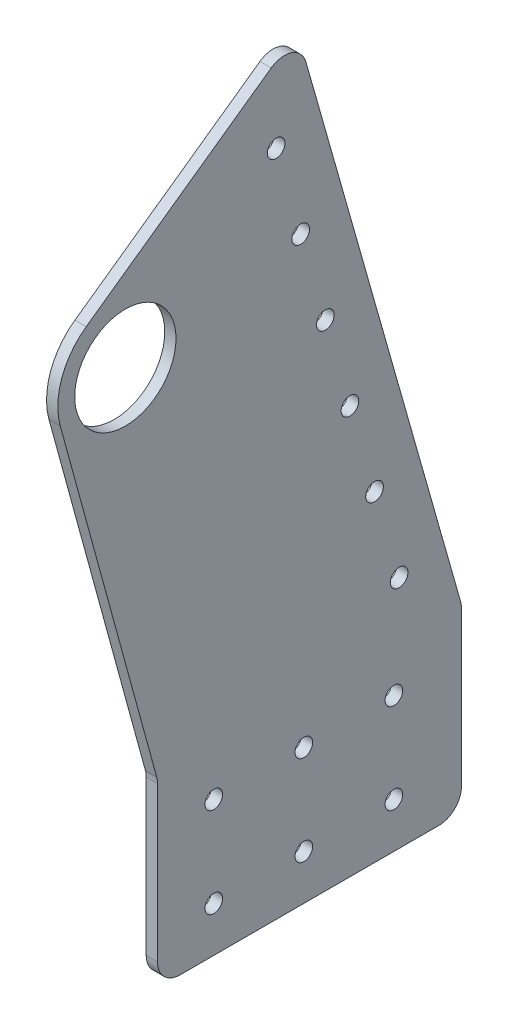
ISO-10303-21;
HEADER;
FILE_DESCRIPTION(('STEP AP214'),'2;1');
FILE_NAME('part.step','',(''),(''),'','','');
FILE_SCHEMA(('AUTOMOTIVE_DESIGN { 1 0 10303 214 1 1 1 1 }'));
ENDSEC;
DATA;
#1=APPLICATION_CONTEXT('core data for automotive mechanical design processes');
#2=APPLICATION_PROTOCOL_DEFINITION('international standard','automotive_design',2000,#1);
#3=PRODUCT_CONTEXT('',#1,'mechanical');
#4=PRODUCT('Part','Part','',(#3));
#5=PRODUCT_RELATED_PRODUCT_CATEGORY('part','',(#4));
#6=PRODUCT_DEFINITION_FORMATION('','',#4);
#7=PRODUCT_DEFINITION_CONTEXT('part definition',#1,'design');
#8=PRODUCT_DEFINITION('design','',#6,#7);
#9=PRODUCT_DEFINITION_SHAPE('','',#8);
#10=(LENGTH_UNIT() NAMED_UNIT(*) SI_UNIT(.MILLI.,.METRE.));
#11=(NAMED_UNIT(*) PLANE_ANGLE_UNIT() SI_UNIT($,.RADIAN.));
#12=(NAMED_UNIT(*) SI_UNIT($,.STERADIAN.) SOLID_ANGLE_UNIT());
#13=UNCERTAINTY_MEASURE_WITH_UNIT(LENGTH_MEASURE(1.E-05),#10,'distance_accuracy_value','');
#14=(GEOMETRIC_REPRESENTATION_CONTEXT(3) GLOBAL_UNCERTAINTY_ASSIGNED_CONTEXT((#13)) GLOBAL_UNIT_ASSIGNED_CONTEXT((#10,
#11,#12)) REPRESENTATION_CONTEXT('',''));
#15=CARTESIAN_POINT('',(0.,0.,0.));
#16=DIRECTION('',(0.,0.,1.));
#17=DIRECTION('',(1.,0.,0.));
#18=AXIS2_PLACEMENT_3D('',#15,#16,#17);
#19=CARTESIAN_POINT('',(1.5875,0.,-130.175));
#20=DIRECTION('',(0.,0.,-1.));
#21=DIRECTION('',(-1.,0.,0.));
#22=AXIS2_PLACEMENT_3D('',#19,#20,#21);
#23=PLANE('',#22);
#24=DIRECTION('',(0.,-1.,0.));
#25=VECTOR('',#24,1.);
#26=CARTESIAN_POINT('',(-1.5875,0.,-130.175));
#27=LINE('',#26,#25);
#28=CARTESIAN_POINT('',(-1.5875,-0.85348532859143,-130.175));
#29=VERTEX_POINT('',#28);
#30=CARTESIAN_POINT('',(-1.5875,-44.45,-130.175));
#31=VERTEX_POINT('',#30);
#32=EDGE_CURVE('E150',#29,#31,#27,.T.);
#33=ORIENTED_EDGE('',*,*,#32,.T.);
#34=DIRECTION('',(-1.,0.,0.));
#35=VECTOR('',#34,1.);
#36=CARTESIAN_POINT('',(1.5875,-44.45,-130.175));
#37=LINE('',#36,#35);
#38=CARTESIAN_POINT('',(1.5875,-44.45,-130.175));
#39=VERTEX_POINT('',#38);
#40=EDGE_CURVE('E364',#31,#39,#37,.F.);
#41=ORIENTED_EDGE('',*,*,#40,.T.);
#42=DIRECTION('',(0.,-1.,0.));
#43=VECTOR('',#42,1.);
#44=CARTESIAN_POINT('',(1.5875,0.,-130.175));
#45=LINE('',#44,#43);
#46=CARTESIAN_POINT('',(1.5875,-0.85348532859143,-130.175));
#47=VERTEX_POINT('',#46);
#48=EDGE_CURVE('E191',#47,#39,#45,.T.);
#49=ORIENTED_EDGE('',*,*,#48,.F.);
#50=DIRECTION('',(-1.,0.,0.));
#51=VECTOR('',#50,1.);
#52=CARTESIAN_POINT('',(-1.5875,-0.85348532859143,-130.175));
#53=LINE('',#52,#51);
#54=EDGE_CURVE('E360',#47,#29,#53,.T.);
#55=ORIENTED_EDGE('',*,*,#54,.T.);
#56=EDGE_LOOP('',(#33,#41,#49,#55));
#57=FACE_BOUND('',#56,.T.);
#58=ADVANCED_FACE('F47',(#57),#23,.F.);
#59=CARTESIAN_POINT('',(1.5875,-50.8,0.));
#60=DIRECTION('',(0.,1.,0.));
#61=DIRECTION('',(0.,0.,1.));
#62=AXIS2_PLACEMENT_3D('',#59,#60,#61);
#63=PLANE('',#62);
#64=DIRECTION('',(0.,0.,-1.));
#65=VECTOR('',#64,1.);
#66=CARTESIAN_POINT('',(-1.5875,-50.8,0.));
#67=LINE('',#66,#65);
#68=CARTESIAN_POINT('',(-1.5875,-50.8,-136.525));
#69=VERTEX_POINT('',#68);
#70=CARTESIAN_POINT('',(-1.5875,-50.8,-209.55));
#71=VERTEX_POINT('',#70);
#72=EDGE_CURVE('E258',#69,#71,#67,.T.);
#73=ORIENTED_EDGE('',*,*,#72,.T.);
#74=DIRECTION('',(-1.,0.,0.));
#75=VECTOR('',#74,1.);
#76=CARTESIAN_POINT('',(1.5875,-50.8,-209.55));
#77=LINE('',#76,#75);
#78=CARTESIAN_POINT('',(1.5875,-50.8,-209.55));
#79=VERTEX_POINT('',#78);
#80=EDGE_CURVE('E357',#71,#79,#77,.F.);
#81=ORIENTED_EDGE('',*,*,#80,.T.);
#82=DIRECTION('',(0.,0.,-1.));
#83=VECTOR('',#82,1.);
#84=CARTESIAN_POINT('',(1.5875,-50.8,0.));
#85=LINE('',#84,#83);
#86=CARTESIAN_POINT('',(1.5875,-50.8,-136.525));
#87=VERTEX_POINT('',#86);
#88=EDGE_CURVE('E195',#87,#79,#85,.T.);
#89=ORIENTED_EDGE('',*,*,#88,.F.);
#90=DIRECTION('',(-1.,0.,0.));
#91=VECTOR('',#90,1.);
#92=CARTESIAN_POINT('',(1.5875,-50.8,-136.525));
#93=LINE('',#92,#91);
#94=EDGE_CURVE('E353',#87,#69,#93,.T.);
#95=ORIENTED_EDGE('',*,*,#94,.T.);
#96=EDGE_LOOP('',(#73,#81,#89,#95));
#97=FACE_BOUND('',#96,.T.);
#98=ADVANCED_FACE('F390',(#97),#63,.F.);
#99=CARTESIAN_POINT('',(1.5875,-1.32116539930395E-11,-215.900000000003));
#100=DIRECTION('',(0.,0.,1.));
#101=DIRECTION('',(0.,-1.,0.));
#102=AXIS2_PLACEMENT_3D('',#99,#100,#101);
#103=PLANE('',#102);
#104=DIRECTION('',(0.,1.,0.));
#105=VECTOR('',#104,1.);
#106=CARTESIAN_POINT('',(-1.5875,-1.32116539930395E-11,-215.900000000003));
#107=LINE('',#106,#105);
#108=CARTESIAN_POINT('',(-1.5875,-44.4500000000004,-215.9));
#109=VERTEX_POINT('',#108);
#110=CARTESIAN_POINT('',(-1.5875,-0.88422284775197,-215.900000000003));
#111=VERTEX_POINT('',#110);
#112=EDGE_CURVE('E262',#109,#111,#107,.T.);
#113=ORIENTED_EDGE('',*,*,#112,.T.);
#114=DIRECTION('',(-1.,0.,0.));
#115=VECTOR('',#114,1.);
#116=CARTESIAN_POINT('',(1.5875,-0.88422284775197,-215.900000000003));
#117=LINE('',#116,#115);
#118=CARTESIAN_POINT('',(1.5875,-0.88422284775197,-215.900000000003));
#119=VERTEX_POINT('',#118);
#120=EDGE_CURVE('E63',#111,#119,#117,.F.);
#121=ORIENTED_EDGE('',*,*,#120,.T.);
#122=DIRECTION('',(0.,1.,0.));
#123=VECTOR('',#122,1.);
#124=CARTESIAN_POINT('',(1.5875,-1.32116539930395E-11,-215.900000000003));
#125=LINE('',#124,#123);
#126=CARTESIAN_POINT('',(1.5875,-44.4500000000004,-215.9));
#127=VERTEX_POINT('',#126);
#128=EDGE_CURVE('E199',#127,#119,#125,.T.);
#129=ORIENTED_EDGE('',*,*,#128,.F.);
#130=DIRECTION('',(-1.,0.,0.));
#131=VECTOR('',#130,1.);
#132=CARTESIAN_POINT('',(1.5875,-44.4500000000004,-215.9));
#133=LINE('',#132,#131);
#134=EDGE_CURVE('E347',#127,#109,#133,.T.);
#135=ORIENTED_EDGE('',*,*,#134,.T.);
#136=EDGE_LOOP('',(#113,#121,#129,#135));
#137=FACE_BOUND('',#136,.T.);
#138=ADVANCED_FACE('F397',(#137),#103,.F.);
#139=CARTESIAN_POINT('',(1.5875,56.7396077259271,-199.785828602504));
#140=DIRECTION('',(0.,0.273198095926513,-0.961957795530619));
#141=DIRECTION('',(0.,0.961957795530619,0.273198095926513));
#142=AXIS2_PLACEMENT_3D('',#139,#140,#141);
#143=PLANE('',#142);
#144=DIRECTION('',(0.,-0.961957795530619,-0.273198095926513));
#145=VECTOR('',#144,1.);
#146=CARTESIAN_POINT('',(-1.5875,56.7396077259271,-199.785828602504));
#147=LINE('',#146,#145);
#148=CARTESIAN_POINT('',(-1.5875,154.425498377896,-172.042824232669));
#149=VERTEX_POINT('',#148);
#150=CARTESIAN_POINT('',(-1.5875,0.850585061381769,-215.658432001622));
#151=VERTEX_POINT('',#150);
#152=EDGE_CURVE('E265',#149,#151,#147,.T.);
#153=ORIENTED_EDGE('',*,*,#152,.F.);
#154=DIRECTION('',(-1.,0.,0.));
#155=VECTOR('',#154,1.);
#156=CARTESIAN_POINT('',(1.5875,154.425498377896,-172.042824232669));
#157=LINE('',#156,#155);
#158=CARTESIAN_POINT('',(1.5875,154.425498377896,-172.042824232669));
#159=VERTEX_POINT('',#158);
#160=EDGE_CURVE('E334',#149,#159,#157,.F.);
#161=ORIENTED_EDGE('',*,*,#160,.T.);
#162=DIRECTION('',(0.,-0.961957795530619,-0.273198095926513));
#163=VECTOR('',#162,1.);
#164=CARTESIAN_POINT('',(1.5875,56.7396077259271,-199.785828602504));
#165=LINE('',#164,#163);
#166=CARTESIAN_POINT('',(1.5875,0.850585061381769,-215.658432001622));
#167=VERTEX_POINT('',#166);
#168=EDGE_CURVE('E202',#159,#167,#165,.T.);
#169=ORIENTED_EDGE('',*,*,#168,.T.);
#170=DIRECTION('',(-1.,0.,0.));
#171=VECTOR('',#170,1.);
#172=CARTESIAN_POINT('',(-1.5875,0.850585061381775,-215.658432001622));
#173=LINE('',#172,#171);
#174=EDGE_CURVE('E330',#167,#151,#173,.T.);
#175=ORIENTED_EDGE('',*,*,#174,.T.);
#176=EDGE_LOOP('',(#153,#161,#169,#175));
#177=FACE_BOUND('',#176,.T.);
#178=ADVANCED_FACE('F404',(#177),#143,.T.);
#179=CARTESIAN_POINT('',(1.5875,-12.7,-171.45));
#180=DIRECTION('',(-1.,0.,0.));
#181=DIRECTION('',(0.,0.,1.));
#182=AXIS2_PLACEMENT_3D('',#179,#180,#181);
#183=CYLINDRICAL_SURFACE('',#182,2.48920000000001);
#184=CARTESIAN_POINT('',(1.5875,-12.7,-171.45));
#185=DIRECTION('',(1.,0.,0.));
#186=DIRECTION('',(0.,0.,-1.));
#187=AXIS2_PLACEMENT_3D('',#184,#185,#186);
#188=CIRCLE('',#187,2.48920000000001);
#189=CARTESIAN_POINT('',(1.5875,-12.7,-173.9392));
#190=VERTEX_POINT('',#189);
#191=EDGE_CURVE('E246',#190,#190,#188,.T.);
#192=ORIENTED_EDGE('',*,*,#191,.T.);
#193=EDGE_LOOP('',(#192));
#194=FACE_BOUND('',#193,.T.);
#195=CARTESIAN_POINT('',(-1.5875,-12.7,-171.45));
#196=DIRECTION('',(1.,0.,0.));
#197=DIRECTION('',(0.,0.,-1.));
#198=AXIS2_PLACEMENT_3D('',#195,#196,#197);
#199=CIRCLE('',#198,2.48920000000001);
#200=CARTESIAN_POINT('',(-1.5875,-12.7,-173.9392));
#201=VERTEX_POINT('',#200);
#202=EDGE_CURVE('E309',#201,#201,#199,.T.);
#203=ORIENTED_EDGE('',*,*,#202,.F.);
#204=EDGE_LOOP('',(#203));
#205=FACE_BOUND('',#204,.T.);
#206=ADVANCED_FACE('F430',(#194,#205),#183,.F.);
#207=CARTESIAN_POINT('',(1.5875,-12.7,-196.85));
#208=DIRECTION('',(-1.,0.,0.));
#209=DIRECTION('',(0.,0.,1.));
#210=AXIS2_PLACEMENT_3D('',#207,#208,#209);
#211=CYLINDRICAL_SURFACE('',#210,2.48920000000001);
#212=CARTESIAN_POINT('',(1.5875,-12.7,-196.85));
#213=DIRECTION('',(1.,0.,0.));
#214=DIRECTION('',(0.,0.,-1.));
#215=AXIS2_PLACEMENT_3D('',#212,#213,#214);
#216=CIRCLE('',#215,2.48920000000001);
#217=CARTESIAN_POINT('',(1.5875,-12.7,-199.3392));
#218=VERTEX_POINT('',#217);
#219=EDGE_CURVE('E242',#218,#218,#216,.T.);
#220=ORIENTED_EDGE('',*,*,#219,.T.);
#221=EDGE_LOOP('',(#220));
#222=FACE_BOUND('',#221,.T.);
#223=CARTESIAN_POINT('',(-1.5875,-12.7,-196.85));
#224=DIRECTION('',(1.,0.,0.));
#225=DIRECTION('',(0.,0.,-1.));
#226=AXIS2_PLACEMENT_3D('',#223,#224,#225);
#227=CIRCLE('',#226,2.48920000000001);
#228=CARTESIAN_POINT('',(-1.5875,-12.7,-199.3392));
#229=VERTEX_POINT('',#228);
#230=EDGE_CURVE('E305',#229,#229,#227,.T.);
#231=ORIENTED_EDGE('',*,*,#230,.F.);
#232=EDGE_LOOP('',(#231));
#233=FACE_BOUND('',#232,.T.);
#234=ADVANCED_FACE('F467',(#222,#233),#211,.F.);
#235=CARTESIAN_POINT('',(1.5875,-38.1,-146.05));
#236=DIRECTION('',(-1.,0.,0.));
#237=DIRECTION('',(0.,0.,1.));
#238=AXIS2_PLACEMENT_3D('',#235,#236,#237);
#239=CYLINDRICAL_SURFACE('',#238,2.4892);
#240=CARTESIAN_POINT('',(1.5875,-38.1,-146.05));
#241=DIRECTION('',(1.,0.,0.));
#242=DIRECTION('',(0.,0.,-1.));
#243=AXIS2_PLACEMENT_3D('',#240,#241,#242);
#244=CIRCLE('',#243,2.4892);
#245=CARTESIAN_POINT('',(1.5875,-38.1,-148.5392));
#246=VERTEX_POINT('',#245);
#247=EDGE_CURVE('E238',#246,#246,#244,.T.);
#248=ORIENTED_EDGE('',*,*,#247,.T.);
#249=EDGE_LOOP('',(#248));
#250=FACE_BOUND('',#249,.T.);
#251=CARTESIAN_POINT('',(-1.5875,-38.1,-146.05));
#252=DIRECTION('',(1.,0.,0.));
#253=DIRECTION('',(0.,0.,-1.));
#254=AXIS2_PLACEMENT_3D('',#251,#252,#253);
#255=CIRCLE('',#254,2.4892);
#256=CARTESIAN_POINT('',(-1.5875,-38.1,-148.5392));
#257=VERTEX_POINT('',#256);
#258=EDGE_CURVE('E301',#257,#257,#255,.T.);
#259=ORIENTED_EDGE('',*,*,#258,.F.);
#260=EDGE_LOOP('',(#259));
#261=FACE_BOUND('',#260,.T.);
#262=ADVANCED_FACE('F463',(#250,#261),#239,.F.);
#263=CARTESIAN_POINT('',(1.5875,-38.1,-171.45));
#264=DIRECTION('',(-1.,0.,0.));
#265=DIRECTION('',(0.,0.,1.));
#266=AXIS2_PLACEMENT_3D('',#263,#264,#265);
#267=CYLINDRICAL_SURFACE('',#266,2.4892);
#268=CARTESIAN_POINT('',(1.5875,-38.1,-171.45));
#269=DIRECTION('',(1.,0.,0.));
#270=DIRECTION('',(0.,0.,-1.));
#271=AXIS2_PLACEMENT_3D('',#268,#269,#270);
#272=CIRCLE('',#271,2.4892);
#273=CARTESIAN_POINT('',(1.5875,-38.1,-173.9392));
#274=VERTEX_POINT('',#273);
#275=EDGE_CURVE('E234',#274,#274,#272,.T.);
#276=ORIENTED_EDGE('',*,*,#275,.T.);
#277=EDGE_LOOP('',(#276));
#278=FACE_BOUND('',#277,.T.);
#279=CARTESIAN_POINT('',(-1.5875,-38.1,-171.45));
#280=DIRECTION('',(1.,0.,0.));
#281=DIRECTION('',(0.,0.,-1.));
#282=AXIS2_PLACEMENT_3D('',#279,#280,#281);
#283=CIRCLE('',#282,2.4892);
#284=CARTESIAN_POINT('',(-1.5875,-38.1,-173.9392));
#285=VERTEX_POINT('',#284);
#286=EDGE_CURVE('E297',#285,#285,#283,.T.);
#287=ORIENTED_EDGE('',*,*,#286,.F.);
#288=EDGE_LOOP('',(#287));
#289=FACE_BOUND('',#288,.T.);
#290=ADVANCED_FACE('F459',(#278,#289),#267,.F.);
#291=CARTESIAN_POINT('',(1.5875,-38.1,-196.85));
#292=DIRECTION('',(-1.,0.,0.));
#293=DIRECTION('',(0.,0.,1.));
#294=AXIS2_PLACEMENT_3D('',#291,#292,#293);
#295=CYLINDRICAL_SURFACE('',#294,2.4892);
#296=CARTESIAN_POINT('',(1.5875,-38.1,-196.85));
#297=DIRECTION('',(1.,0.,0.));
#298=DIRECTION('',(0.,0.,-1.));
#299=AXIS2_PLACEMENT_3D('',#296,#297,#298);
#300=CIRCLE('',#299,2.4892);
#301=CARTESIAN_POINT('',(1.5875,-38.1,-199.3392));
#302=VERTEX_POINT('',#301);
#303=EDGE_CURVE('E230',#302,#302,#300,.T.);
#304=ORIENTED_EDGE('',*,*,#303,.T.);
#305=EDGE_LOOP('',(#304));
#306=FACE_BOUND('',#305,.T.);
#307=CARTESIAN_POINT('',(-1.5875,-38.1,-196.85));
#308=DIRECTION('',(1.,0.,0.));
#309=DIRECTION('',(0.,0.,-1.));
#310=AXIS2_PLACEMENT_3D('',#307,#308,#309);
#311=CIRCLE('',#310,2.4892);
#312=CARTESIAN_POINT('',(-1.5875,-38.1,-199.3392));
#313=VERTEX_POINT('',#312);
#314=EDGE_CURVE('E293',#313,#313,#311,.T.);
#315=ORIENTED_EDGE('',*,*,#314,.F.);
#316=EDGE_LOOP('',(#315));
#317=FACE_BOUND('',#316,.T.);
#318=ADVANCED_FACE('F455',(#306,#317),#295,.F.);
#319=CARTESIAN_POINT('',(1.5875,113.107600081329,-170.574954369506));
#320=DIRECTION('',(-1.,0.,0.));
#321=DIRECTION('',(0.,0.,1.));
#322=AXIS2_PLACEMENT_3D('',#319,#320,#321);
#323=CYLINDRICAL_SURFACE('',#322,2.48919999999932);
#324=CARTESIAN_POINT('',(1.5875,113.107600081329,-170.574954369506));
#325=DIRECTION('',(1.,0.,0.));
#326=DIRECTION('',(0.,0.,-1.));
#327=AXIS2_PLACEMENT_3D('',#324,#325,#326);
#328=CIRCLE('',#327,2.48919999999932);
#329=CARTESIAN_POINT('',(1.5875,113.107600081329,-173.064154369506));
#330=VERTEX_POINT('',#329);
#331=EDGE_CURVE('E226',#330,#330,#328,.T.);
#332=ORIENTED_EDGE('',*,*,#331,.T.);
#333=EDGE_LOOP('',(#332));
#334=FACE_BOUND('',#333,.T.);
#335=CARTESIAN_POINT('',(-1.5875,113.107600081329,-170.574954369506));
#336=DIRECTION('',(1.,0.,0.));
#337=DIRECTION('',(0.,0.,-1.));
#338=AXIS2_PLACEMENT_3D('',#335,#336,#337);
#339=CIRCLE('',#338,2.48919999999932);
#340=CARTESIAN_POINT('',(-1.5875,113.107600081329,-173.064154369506));
#341=VERTEX_POINT('',#340);
#342=EDGE_CURVE('E289',#341,#341,#339,.T.);
#343=ORIENTED_EDGE('',*,*,#342,.F.);
#344=EDGE_LOOP('',(#343));
#345=FACE_BOUND('',#344,.T.);
#346=ADVANCED_FACE('F451',(#334,#345),#323,.F.);
#347=CARTESIAN_POINT('',(1.5875,88.6738720748508,-177.51418600604));
#348=DIRECTION('',(-1.,0.,0.));
#349=DIRECTION('',(0.,0.,1.));
#350=AXIS2_PLACEMENT_3D('',#347,#348,#349);
#351=CYLINDRICAL_SURFACE('',#350,2.48919999999935);
#352=CARTESIAN_POINT('',(1.5875,88.6738720748508,-177.51418600604));
#353=DIRECTION('',(1.,0.,0.));
#354=DIRECTION('',(0.,0.,-1.));
#355=AXIS2_PLACEMENT_3D('',#352,#353,#354);
#356=CIRCLE('',#355,2.48919999999935);
#357=CARTESIAN_POINT('',(1.5875,88.6738720748508,-180.003386006039));
#358=VERTEX_POINT('',#357);
#359=EDGE_CURVE('E222',#358,#358,#356,.T.);
#360=ORIENTED_EDGE('',*,*,#359,.T.);
#361=EDGE_LOOP('',(#360));
#362=FACE_BOUND('',#361,.T.);
#363=CARTESIAN_POINT('',(-1.5875,88.6738720748508,-177.51418600604));
#364=DIRECTION('',(1.,0.,0.));
#365=DIRECTION('',(0.,0.,-1.));
#366=AXIS2_PLACEMENT_3D('',#363,#364,#365);
#367=CIRCLE('',#366,2.48919999999935);
#368=CARTESIAN_POINT('',(-1.5875,88.6738720748508,-180.003386006039));
#369=VERTEX_POINT('',#368);
#370=EDGE_CURVE('E285',#369,#369,#367,.T.);
#371=ORIENTED_EDGE('',*,*,#370,.F.);
#372=EDGE_LOOP('',(#371));
#373=FACE_BOUND('',#372,.T.);
#374=ADVANCED_FACE('F447',(#362,#373),#351,.F.);
#375=CARTESIAN_POINT('',(1.5875,64.240144068373,-184.453417642573));
#376=DIRECTION('',(-1.,0.,0.));
#377=DIRECTION('',(0.,0.,1.));
#378=AXIS2_PLACEMENT_3D('',#375,#376,#377);
#379=CYLINDRICAL_SURFACE('',#378,2.48919999999937);
#380=CARTESIAN_POINT('',(1.5875,64.240144068373,-184.453417642573));
#381=DIRECTION('',(1.,0.,0.));
#382=DIRECTION('',(0.,0.,-1.));
#383=AXIS2_PLACEMENT_3D('',#380,#381,#382);
#384=CIRCLE('',#383,2.48919999999937);
#385=CARTESIAN_POINT('',(1.5875,64.240144068373,-186.942617642572));
#386=VERTEX_POINT('',#385);
#387=EDGE_CURVE('E218',#386,#386,#384,.T.);
#388=ORIENTED_EDGE('',*,*,#387,.T.);
#389=EDGE_LOOP('',(#388));
#390=FACE_BOUND('',#389,.T.);
#391=CARTESIAN_POINT('',(-1.5875,64.240144068373,-184.453417642573));
#392=DIRECTION('',(1.,0.,0.));
#393=DIRECTION('',(0.,0.,-1.));
#394=AXIS2_PLACEMENT_3D('',#391,#392,#393);
#395=CIRCLE('',#394,2.48919999999937);
#396=CARTESIAN_POINT('',(-1.5875,64.240144068373,-186.942617642572));
#397=VERTEX_POINT('',#396);
#398=EDGE_CURVE('E281',#397,#397,#395,.T.);
#399=ORIENTED_EDGE('',*,*,#398,.F.);
#400=EDGE_LOOP('',(#399));
#401=FACE_BOUND('',#400,.T.);
#402=ADVANCED_FACE('F443',(#390,#401),#379,.F.);
#403=CARTESIAN_POINT('',(1.5875,39.8064160618953,-191.392649279106));
#404=DIRECTION('',(-1.,0.,0.));
#405=DIRECTION('',(0.,0.,1.));
#406=AXIS2_PLACEMENT_3D('',#403,#404,#405);
#407=CYLINDRICAL_SURFACE('',#406,2.48919999999935);
#408=CARTESIAN_POINT('',(1.5875,39.8064160618953,-191.392649279106));
#409=DIRECTION('',(1.,0.,0.));
#410=DIRECTION('',(0.,0.,-1.));
#411=AXIS2_PLACEMENT_3D('',#408,#409,#410);
#412=CIRCLE('',#411,2.48919999999935);
#413=CARTESIAN_POINT('',(1.5875,39.8064160618953,-193.881849279106));
#414=VERTEX_POINT('',#413);
#415=EDGE_CURVE('E214',#414,#414,#412,.T.);
#416=ORIENTED_EDGE('',*,*,#415,.T.);
#417=EDGE_LOOP('',(#416));
#418=FACE_BOUND('',#417,.T.);
#419=CARTESIAN_POINT('',(-1.5875,39.8064160618953,-191.392649279106));
#420=DIRECTION('',(1.,0.,0.));
#421=DIRECTION('',(0.,0.,-1.));
#422=AXIS2_PLACEMENT_3D('',#419,#420,#421);
#423=CIRCLE('',#422,2.48919999999935);
#424=CARTESIAN_POINT('',(-1.5875,39.8064160618953,-193.881849279106));
#425=VERTEX_POINT('',#424);
#426=EDGE_CURVE('E277',#425,#425,#423,.T.);
#427=ORIENTED_EDGE('',*,*,#426,.F.);
#428=EDGE_LOOP('',(#427));
#429=FACE_BOUND('',#428,.T.);
#430=ADVANCED_FACE('F439',(#418,#429),#407,.F.);
#431=CARTESIAN_POINT('',(1.5875,15.3726880554176,-198.33188091564));
#432=DIRECTION('',(-1.,0.,0.));
#433=DIRECTION('',(0.,0.,1.));
#434=AXIS2_PLACEMENT_3D('',#431,#432,#433);
#435=CYLINDRICAL_SURFACE('',#434,2.48919999999935);
#436=CARTESIAN_POINT('',(1.5875,15.3726880554176,-198.33188091564));
#437=DIRECTION('',(1.,0.,0.));
#438=DIRECTION('',(0.,0.,-1.));
#439=AXIS2_PLACEMENT_3D('',#436,#437,#438);
#440=CIRCLE('',#439,2.48919999999935);
#441=CARTESIAN_POINT('',(1.5875,15.3726880554176,-200.821080915639));
#442=VERTEX_POINT('',#441);
#443=EDGE_CURVE('E210',#442,#442,#440,.T.);
#444=ORIENTED_EDGE('',*,*,#443,.T.);
#445=EDGE_LOOP('',(#444));
#446=FACE_BOUND('',#445,.T.);
#447=CARTESIAN_POINT('',(-1.5875,15.3726880554176,-198.33188091564));
#448=DIRECTION('',(1.,0.,0.));
#449=DIRECTION('',(0.,0.,-1.));
#450=AXIS2_PLACEMENT_3D('',#447,#448,#449);
#451=CIRCLE('',#450,2.48919999999935);
#452=CARTESIAN_POINT('',(-1.5875,15.3726880554176,-200.821080915639));
#453=VERTEX_POINT('',#452);
#454=EDGE_CURVE('E273',#453,#453,#451,.T.);
#455=ORIENTED_EDGE('',*,*,#454,.F.);
#456=EDGE_LOOP('',(#455));
#457=FACE_BOUND('',#456,.T.);
#458=ADVANCED_FACE('F435',(#446,#457),#435,.F.);
#459=CARTESIAN_POINT('',(1.5875,137.541328087806,-163.635722732973));
#460=DIRECTION('',(-1.,0.,0.));
#461=DIRECTION('',(0.,0.,1.));
#462=AXIS2_PLACEMENT_3D('',#459,#460,#461);
#463=CYLINDRICAL_SURFACE('',#462,2.48919999999935);
#464=CARTESIAN_POINT('',(-1.5875,137.541328087806,-163.635722732973));
#465=DIRECTION('',(1.,0.,0.));
#466=DIRECTION('',(0.,0.,-1.));
#467=AXIS2_PLACEMENT_3D('',#464,#465,#466);
#468=CIRCLE('',#467,2.48919999999935);
#469=CARTESIAN_POINT('',(-1.5875,137.541328087806,-166.124922732972));
#470=VERTEX_POINT('',#469);
#471=EDGE_CURVE('E269',#470,#470,#468,.T.);
#472=ORIENTED_EDGE('',*,*,#471,.F.);
#473=EDGE_LOOP('',(#472));
#474=FACE_BOUND('',#473,.T.);
#475=CARTESIAN_POINT('',(1.5875,137.541328087806,-163.635722732973));
#476=DIRECTION('',(1.,0.,0.));
#477=DIRECTION('',(0.,0.,-1.));
#478=AXIS2_PLACEMENT_3D('',#475,#476,#477);
#479=CIRCLE('',#478,2.48919999999935);
#480=CARTESIAN_POINT('',(1.5875,137.541328087806,-166.124922732972));
#481=VERTEX_POINT('',#480);
#482=EDGE_CURVE('E206',#481,#481,#479,.T.);
#483=ORIENTED_EDGE('',*,*,#482,.T.);
#484=EDGE_LOOP('',(#483));
#485=FACE_BOUND('',#484,.T.);
#486=ADVANCED_FACE('F431',(#474,#485),#463,.F.);
#487=CARTESIAN_POINT('',(1.5875,-12.7,-146.05));
#488=DIRECTION('',(-1.,0.,0.));
#489=DIRECTION('',(0.,0.,1.));
#490=AXIS2_PLACEMENT_3D('',#487,#488,#489);
#491=CYLINDRICAL_SURFACE('',#490,2.48920000000001);
#492=CARTESIAN_POINT('',(1.5875,-12.7,-146.05));
#493=DIRECTION('',(1.,0.,0.));
#494=DIRECTION('',(0.,0.,-1.));
#495=AXIS2_PLACEMENT_3D('',#492,#493,#494);
#496=CIRCLE('',#495,2.48920000000001);
#497=CARTESIAN_POINT('',(1.5875,-12.7,-148.5392));
#498=VERTEX_POINT('',#497);
#499=EDGE_CURVE('E250',#498,#498,#496,.T.);
#500=ORIENTED_EDGE('',*,*,#499,.T.);
#501=EDGE_LOOP('',(#500));
#502=FACE_BOUND('',#501,.T.);
#503=CARTESIAN_POINT('',(-1.5875,-12.7,-146.05));
#504=DIRECTION('',(1.,0.,0.));
#505=DIRECTION('',(0.,0.,-1.));
#506=AXIS2_PLACEMENT_3D('',#503,#504,#505);
#507=CIRCLE('',#506,2.48920000000001);
#508=CARTESIAN_POINT('',(-1.5875,-12.7,-148.5392));
#509=VERTEX_POINT('',#508);
#510=EDGE_CURVE('E196',#509,#509,#507,.T.);
#511=ORIENTED_EDGE('',*,*,#510,.F.);
#512=EDGE_LOOP('',(#511));
#513=FACE_BOUND('',#512,.T.);
#514=ADVANCED_FACE('F434',(#502,#513),#491,.F.);
#515=CARTESIAN_POINT('',(1.5875,0.,0.));
#516=DIRECTION('',(1.,0.,0.));
#517=DIRECTION('',(0.,0.,-1.));
#518=AXIS2_PLACEMENT_3D('',#515,#516,#517);
#519=PLANE('',#518);
#520=ORIENTED_EDGE('',*,*,#168,.F.);
#521=CARTESIAN_POINT('',(1.5875,152.690690468763,-165.934392231049));
#522=DIRECTION('',(1.,0.,0.));
#523=DIRECTION('',(0.,0.,-1.));
#524=AXIS2_PLACEMENT_3D('',#521,#522,#523);
#525=CIRCLE('',#524,6.35);
#526=CARTESIAN_POINT('',(1.5875,157.865986611329,-162.254880057304));
#527=VERTEX_POINT('',#526);
#528=EDGE_CURVE('E166',#159,#527,#525,.T.);
#529=ORIENTED_EDGE('',*,*,#528,.T.);
#530=DIRECTION('',(0.,0.57945073602286,-0.815007266545867));
#531=VECTOR('',#530,1.);
#532=CARTESIAN_POINT('',(1.5875,28.2344732297924,20.0740373316662));
#533=LINE('',#532,#531);
#534=CARTESIAN_POINT('',(1.5875,120.768248427699,-110.076283478765));
#535=VERTEX_POINT('',#534);
#536=EDGE_CURVE('E143',#535,#527,#533,.T.);
#537=ORIENTED_EDGE('',*,*,#536,.F.);
#538=CARTESIAN_POINT('',(1.5875,105.24236,-121.11482));
#539=DIRECTION('',(1.,0.,0.));
#540=DIRECTION('',(0.,0.,-1.));
#541=AXIS2_PLACEMENT_3D('',#538,#539,#540);
#542=CIRCLE('',#541,19.05);
#543=CARTESIAN_POINT('',(1.5875,100.212317155034,-102.740893664624));
#544=VERTEX_POINT('',#543);
#545=EDGE_CURVE('E154',#535,#544,#542,.T.);
#546=ORIENTED_EDGE('',*,*,#545,.T.);
#547=DIRECTION('',(0.,-0.96451056878613,-0.264044243830189));
#548=VECTOR('',#547,1.);
#549=CARTESIAN_POINT('',(1.5875,33.1521181503419,-121.099281960546));
#550=LINE('',#549,#548);
#551=CARTESIAN_POINT('',(1.5875,0.823195619730259,-129.949642111792));
#552=VERTEX_POINT('',#551);
#553=EDGE_CURVE('E160',#544,#552,#550,.T.);
#554=ORIENTED_EDGE('',*,*,#553,.T.);
#555=CARTESIAN_POINT('',(1.5875,-0.85348532859143,-123.825));
#556=DIRECTION('',(1.,0.,0.));
#557=DIRECTION('',(0.,0.,-1.));
#558=AXIS2_PLACEMENT_3D('',#555,#556,#557);
#559=CIRCLE('',#558,6.35);
#560=EDGE_CURVE('E11',#552,#47,#559,.F.);
#561=ORIENTED_EDGE('',*,*,#560,.T.);
#562=ORIENTED_EDGE('',*,*,#48,.T.);
#563=CARTESIAN_POINT('',(1.5875,-44.45,-136.525));
#564=DIRECTION('',(1.,0.,0.));
#565=DIRECTION('',(0.,0.,-1.));
#566=AXIS2_PLACEMENT_3D('',#563,#564,#565);
#567=CIRCLE('',#566,6.35);
#568=EDGE_CURVE('E337',#39,#87,#567,.T.);
#569=ORIENTED_EDGE('',*,*,#568,.T.);
#570=ORIENTED_EDGE('',*,*,#88,.T.);
#571=CARTESIAN_POINT('',(1.5875,-44.45,-209.55));
#572=DIRECTION('',(1.,0.,0.));
#573=DIRECTION('',(0.,0.,-1.));
#574=AXIS2_PLACEMENT_3D('',#571,#572,#573);
#575=CIRCLE('',#574,6.35);
#576=EDGE_CURVE('E70',#79,#127,#575,.T.);
#577=ORIENTED_EDGE('',*,*,#576,.T.);
#578=ORIENTED_EDGE('',*,*,#128,.T.);
#579=CARTESIAN_POINT('',(1.5875,-0.884222847751581,-209.550000000003));
#580=DIRECTION('',(1.,0.,0.));
#581=DIRECTION('',(0.,0.,-1.));
#582=AXIS2_PLACEMENT_3D('',#579,#580,#581);
#583=CIRCLE('',#582,6.35);
#584=EDGE_CURVE('E342',#119,#167,#583,.T.);
#585=ORIENTED_EDGE('',*,*,#584,.T.);
#586=EDGE_LOOP('',(#520,#529,#537,#546,#554,#561,#562,#569,#570,#577,#578,#585));
#587=FACE_BOUND('',#586,.T.);
#588=ORIENTED_EDGE('',*,*,#482,.F.);
#589=EDGE_LOOP('',(#588));
#590=FACE_BOUND('',#589,.T.);
#591=ORIENTED_EDGE('',*,*,#443,.F.);
#592=EDGE_LOOP('',(#591));
#593=FACE_BOUND('',#592,.T.);
#594=ORIENTED_EDGE('',*,*,#415,.F.);
#595=EDGE_LOOP('',(#594));
#596=FACE_BOUND('',#595,.T.);
#597=ORIENTED_EDGE('',*,*,#387,.F.);
#598=EDGE_LOOP('',(#597));
#599=FACE_BOUND('',#598,.T.);
#600=ORIENTED_EDGE('',*,*,#359,.F.);
#601=EDGE_LOOP('',(#600));
#602=FACE_BOUND('',#601,.T.);
#603=ORIENTED_EDGE('',*,*,#331,.F.);
#604=EDGE_LOOP('',(#603));
#605=FACE_BOUND('',#604,.T.);
#606=ORIENTED_EDGE('',*,*,#303,.F.);
#607=EDGE_LOOP('',(#606));
#608=FACE_BOUND('',#607,.T.);
#609=ORIENTED_EDGE('',*,*,#275,.F.);
#610=EDGE_LOOP('',(#609));
#611=FACE_BOUND('',#610,.T.);
#612=ORIENTED_EDGE('',*,*,#247,.F.);
#613=EDGE_LOOP('',(#612));
#614=FACE_BOUND('',#613,.T.);
#615=ORIENTED_EDGE('',*,*,#219,.F.);
#616=EDGE_LOOP('',(#615));
#617=FACE_BOUND('',#616,.T.);
#618=ORIENTED_EDGE('',*,*,#191,.F.);
#619=EDGE_LOOP('',(#618));
#620=FACE_BOUND('',#619,.T.);
#621=ORIENTED_EDGE('',*,*,#499,.F.);
#622=EDGE_LOOP('',(#621));
#623=FACE_BOUND('',#622,.T.);
#624=CARTESIAN_POINT('',(1.5875,105.24236,-121.11482));
#625=DIRECTION('',(1.,0.,0.));
#626=DIRECTION('',(0.,0.,-1.));
#627=AXIS2_PLACEMENT_3D('',#624,#625,#626);
#628=CIRCLE('',#627,14.2875);
#629=CARTESIAN_POINT('',(1.5875,105.24236,-135.40232));
#630=VERTEX_POINT('',#629);
#631=EDGE_CURVE('E177',#630,#630,#628,.T.);
#632=ORIENTED_EDGE('',*,*,#631,.F.);
#633=EDGE_LOOP('',(#632));
#634=FACE_BOUND('',#633,.T.);
#635=ADVANCED_FACE('F163',(#587,#590,#593,#596,#599,#602,#605,#608,#611,#614,#617,#620,#623,
#634),#519,.T.);
#636=CARTESIAN_POINT('',(-1.5875,0.,0.));
#637=DIRECTION('',(1.,0.,0.));
#638=DIRECTION('',(0.,0.,-1.));
#639=AXIS2_PLACEMENT_3D('',#636,#637,#638);
#640=PLANE('',#639);
#641=DIRECTION('',(0.,0.57945073602286,-0.815007266545867));
#642=VECTOR('',#641,1.);
#643=CARTESIAN_POINT('',(-1.5875,28.2344732297924,20.0740373316662));
#644=LINE('',#643,#642);
#645=CARTESIAN_POINT('',(-1.5875,120.768248427699,-110.076283478765));
#646=VERTEX_POINT('',#645);
#647=CARTESIAN_POINT('',(-1.5875,157.865986611329,-162.254880057304));
#648=VERTEX_POINT('',#647);
#649=EDGE_CURVE('E146',#646,#648,#644,.T.);
#650=ORIENTED_EDGE('',*,*,#649,.T.);
#651=CARTESIAN_POINT('',(-1.5875,152.690690468763,-165.934392231049));
#652=DIRECTION('',(1.,0.,0.));
#653=DIRECTION('',(0.,0.,-1.));
#654=AXIS2_PLACEMENT_3D('',#651,#652,#653);
#655=CIRCLE('',#654,6.35);
#656=EDGE_CURVE('E327',#648,#149,#655,.F.);
#657=ORIENTED_EDGE('',*,*,#656,.T.);
#658=ORIENTED_EDGE('',*,*,#152,.T.);
#659=CARTESIAN_POINT('',(-1.5875,-0.884222847751581,-209.550000000003));
#660=DIRECTION('',(1.,0.,0.));
#661=DIRECTION('',(0.,0.,-1.));
#662=AXIS2_PLACEMENT_3D('',#659,#660,#661);
#663=CIRCLE('',#662,6.35);
#664=EDGE_CURVE('E324',#151,#111,#663,.F.);
#665=ORIENTED_EDGE('',*,*,#664,.T.);
#666=ORIENTED_EDGE('',*,*,#112,.F.);
#667=CARTESIAN_POINT('',(-1.5875,-44.45,-209.55));
#668=DIRECTION('',(1.,0.,0.));
#669=DIRECTION('',(0.,0.,-1.));
#670=AXIS2_PLACEMENT_3D('',#667,#668,#669);
#671=CIRCLE('',#670,6.35);
#672=EDGE_CURVE('E321',#109,#71,#671,.F.);
#673=ORIENTED_EDGE('',*,*,#672,.T.);
#674=ORIENTED_EDGE('',*,*,#72,.F.);
#675=CARTESIAN_POINT('',(-1.5875,-44.45,-136.525));
#676=DIRECTION('',(1.,0.,0.));
#677=DIRECTION('',(0.,0.,-1.));
#678=AXIS2_PLACEMENT_3D('',#675,#676,#677);
#679=CIRCLE('',#678,6.35);
#680=EDGE_CURVE('E318',#69,#31,#679,.F.);
#681=ORIENTED_EDGE('',*,*,#680,.T.);
#682=ORIENTED_EDGE('',*,*,#32,.F.);
#683=CARTESIAN_POINT('',(-1.5875,-0.85348532859143,-123.825));
#684=DIRECTION('',(1.,0.,0.));
#685=DIRECTION('',(0.,0.,-1.));
#686=AXIS2_PLACEMENT_3D('',#683,#684,#685);
#687=CIRCLE('',#686,6.35);
#688=CARTESIAN_POINT('',(-1.5875,0.823195619730259,-129.949642111792));
#689=VERTEX_POINT('',#688);
#690=EDGE_CURVE('E56',#29,#689,#687,.T.);
#691=ORIENTED_EDGE('',*,*,#690,.T.);
#692=DIRECTION('',(0.,-0.96451056878613,-0.264044243830189));
#693=VECTOR('',#692,1.);
#694=CARTESIAN_POINT('',(-1.5875,33.1521181503419,-121.099281960546));
#695=LINE('',#694,#693);
#696=CARTESIAN_POINT('',(-1.5875,100.212317155034,-102.740893664624));
#697=VERTEX_POINT('',#696);
#698=EDGE_CURVE('E172',#697,#689,#695,.T.);
#699=ORIENTED_EDGE('',*,*,#698,.F.);
#700=CARTESIAN_POINT('',(-1.5875,105.24236,-121.11482));
#701=DIRECTION('',(1.,0.,0.));
#702=DIRECTION('',(0.,0.,-1.));
#703=AXIS2_PLACEMENT_3D('',#700,#701,#702);
#704=CIRCLE('',#703,19.05);
#705=EDGE_CURVE('E183',#646,#697,#704,.T.);
#706=ORIENTED_EDGE('',*,*,#705,.F.);
#707=EDGE_LOOP('',(#650,#657,#658,#665,#666,#673,#674,#681,#682,#691,#699,#706));
#708=FACE_BOUND('',#707,.T.);
#709=ORIENTED_EDGE('',*,*,#471,.T.);
#710=EDGE_LOOP('',(#709));
#711=FACE_BOUND('',#710,.T.);
#712=ORIENTED_EDGE('',*,*,#454,.T.);
#713=EDGE_LOOP('',(#712));
#714=FACE_BOUND('',#713,.T.);
#715=ORIENTED_EDGE('',*,*,#426,.T.);
#716=EDGE_LOOP('',(#715));
#717=FACE_BOUND('',#716,.T.);
#718=ORIENTED_EDGE('',*,*,#398,.T.);
#719=EDGE_LOOP('',(#718));
#720=FACE_BOUND('',#719,.T.);
#721=ORIENTED_EDGE('',*,*,#370,.T.);
#722=EDGE_LOOP('',(#721));
#723=FACE_BOUND('',#722,.T.);
#724=ORIENTED_EDGE('',*,*,#342,.T.);
#725=EDGE_LOOP('',(#724));
#726=FACE_BOUND('',#725,.T.);
#727=ORIENTED_EDGE('',*,*,#314,.T.);
#728=EDGE_LOOP('',(#727));
#729=FACE_BOUND('',#728,.T.);
#730=ORIENTED_EDGE('',*,*,#286,.T.);
#731=EDGE_LOOP('',(#730));
#732=FACE_BOUND('',#731,.T.);
#733=ORIENTED_EDGE('',*,*,#258,.T.);
#734=EDGE_LOOP('',(#733));
#735=FACE_BOUND('',#734,.T.);
#736=ORIENTED_EDGE('',*,*,#230,.T.);
#737=EDGE_LOOP('',(#736));
#738=FACE_BOUND('',#737,.T.);
#739=ORIENTED_EDGE('',*,*,#202,.T.);
#740=EDGE_LOOP('',(#739));
#741=FACE_BOUND('',#740,.T.);
#742=ORIENTED_EDGE('',*,*,#510,.T.);
#743=EDGE_LOOP('',(#742));
#744=FACE_BOUND('',#743,.T.);
#745=CARTESIAN_POINT('',(-1.5875,105.24236,-121.11482));
#746=DIRECTION('',(1.,0.,0.));
#747=DIRECTION('',(0.,0.,-1.));
#748=AXIS2_PLACEMENT_3D('',#745,#746,#747);
#749=CIRCLE('',#748,14.2875);
#750=CARTESIAN_POINT('',(-1.5875,105.24236,-135.40232));
#751=VERTEX_POINT('',#750);
#752=EDGE_CURVE('E168',#751,#751,#749,.T.);
#753=ORIENTED_EDGE('',*,*,#752,.T.);
#754=EDGE_LOOP('',(#753));
#755=FACE_BOUND('',#754,.T.);
#756=ADVANCED_FACE('F373',(#708,#711,#714,#717,#720,#723,#726,#729,#732,#735,#738,#741,#744,
#755),#640,.F.);
#757=CARTESIAN_POINT('',(1.5875,28.2344732297924,20.0740373316662));
#758=DIRECTION('',(0.,0.815007266545867,0.57945073602286));
#759=DIRECTION('',(0.,-0.57945073602286,0.815007266545867));
#760=AXIS2_PLACEMENT_3D('',#757,#758,#759);
#761=PLANE('',#760);
#762=ORIENTED_EDGE('',*,*,#536,.T.);
#763=DIRECTION('',(-1.,0.,0.));
#764=VECTOR('',#763,1.);
#765=CARTESIAN_POINT('',(1.5875,157.865986611329,-162.254880057304));
#766=LINE('',#765,#764);
#767=EDGE_CURVE('E254',#527,#648,#766,.T.);
#768=ORIENTED_EDGE('',*,*,#767,.T.);
#769=ORIENTED_EDGE('',*,*,#649,.F.);
#770=DIRECTION('',(-1.,0.,0.));
#771=VECTOR('',#770,1.);
#772=CARTESIAN_POINT('',(1.5875,120.768248427699,-110.076283478765));
#773=LINE('',#772,#771);
#774=EDGE_CURVE('E138',#535,#646,#773,.T.);
#775=ORIENTED_EDGE('',*,*,#774,.F.);
#776=EDGE_LOOP('',(#762,#768,#769,#775));
#777=FACE_BOUND('',#776,.T.);
#778=ADVANCED_FACE('F140',(#777),#761,.T.);
#779=CARTESIAN_POINT('',(1.5875,105.24236,-121.11482));
#780=DIRECTION('',(-1.,0.,0.));
#781=DIRECTION('',(0.,0.,1.));
#782=AXIS2_PLACEMENT_3D('',#779,#780,#781);
#783=CYLINDRICAL_SURFACE('',#782,19.05);
#784=ORIENTED_EDGE('',*,*,#705,.T.);
#785=DIRECTION('',(-1.,0.,0.));
#786=VECTOR('',#785,1.);
#787=CARTESIAN_POINT('',(1.5875,100.212317155034,-102.740893664624));
#788=LINE('',#787,#786);
#789=EDGE_CURVE('E151',#544,#697,#788,.T.);
#790=ORIENTED_EDGE('',*,*,#789,.F.);
#791=ORIENTED_EDGE('',*,*,#545,.F.);
#792=ORIENTED_EDGE('',*,*,#774,.T.);
#793=EDGE_LOOP('',(#784,#790,#791,#792));
#794=FACE_BOUND('',#793,.T.);
#795=ADVANCED_FACE('F155',(#794),#783,.T.);
#796=CARTESIAN_POINT('',(1.5875,33.1521181503419,-121.099281960546));
#797=DIRECTION('',(0.,0.264044243830189,-0.96451056878613));
#798=DIRECTION('',(0.,0.96451056878613,0.264044243830189));
#799=AXIS2_PLACEMENT_3D('',#796,#797,#798);
#800=PLANE('',#799);
#801=ORIENTED_EDGE('',*,*,#698,.T.);
#802=DIRECTION('',(-1.,0.,0.));
#803=VECTOR('',#802,1.);
#804=CARTESIAN_POINT('',(1.5875,0.823195619730267,-129.949642111792));
#805=LINE('',#804,#803);
#806=EDGE_CURVE('E367',#689,#552,#805,.F.);
#807=ORIENTED_EDGE('',*,*,#806,.T.);
#808=ORIENTED_EDGE('',*,*,#553,.F.);
#809=ORIENTED_EDGE('',*,*,#789,.T.);
#810=EDGE_LOOP('',(#801,#807,#808,#809));
#811=FACE_BOUND('',#810,.T.);
#812=ADVANCED_FACE('F379',(#811),#800,.F.);
#813=CARTESIAN_POINT('',(1.5875,105.24236,-121.11482));
#814=DIRECTION('',(-1.,0.,0.));
#815=DIRECTION('',(0.,0.,1.));
#816=AXIS2_PLACEMENT_3D('',#813,#814,#815);
#817=CYLINDRICAL_SURFACE('',#816,14.2875);
#818=ORIENTED_EDGE('',*,*,#631,.T.);
#819=EDGE_LOOP('',(#818));
#820=FACE_BOUND('',#819,.T.);
#821=ORIENTED_EDGE('',*,*,#752,.F.);
#822=EDGE_LOOP('',(#821));
#823=FACE_BOUND('',#822,.T.);
#824=ADVANCED_FACE('F409',(#820,#823),#817,.F.);
#825=CARTESIAN_POINT('',(1.5875,152.690690468763,-165.934392231049));
#826=DIRECTION('',(-1.,0.,0.));
#827=DIRECTION('',(0.,0.,1.));
#828=AXIS2_PLACEMENT_3D('',#825,#826,#827);
#829=CYLINDRICAL_SURFACE('',#828,6.35);
#830=ORIENTED_EDGE('',*,*,#528,.F.);
#831=ORIENTED_EDGE('',*,*,#160,.F.);
#832=ORIENTED_EDGE('',*,*,#656,.F.);
#833=ORIENTED_EDGE('',*,*,#767,.F.);
#834=EDGE_LOOP('',(#830,#831,#832,#833));
#835=FACE_BOUND('',#834,.T.);
#836=ADVANCED_FACE('F407',(#835),#829,.T.);
#837=CARTESIAN_POINT('',(1.5875,-0.884222847751581,-209.550000000003));
#838=DIRECTION('',(1.,0.,0.));
#839=DIRECTION('',(0.,0.,-1.));
#840=AXIS2_PLACEMENT_3D('',#837,#838,#839);
#841=CYLINDRICAL_SURFACE('',#840,6.35);
#842=ORIENTED_EDGE('',*,*,#584,.F.);
#843=ORIENTED_EDGE('',*,*,#120,.F.);
#844=ORIENTED_EDGE('',*,*,#664,.F.);
#845=ORIENTED_EDGE('',*,*,#174,.F.);
#846=EDGE_LOOP('',(#842,#843,#844,#845));
#847=FACE_BOUND('',#846,.T.);
#848=ADVANCED_FACE('F402',(#847),#841,.T.);
#849=CARTESIAN_POINT('',(1.5875,-44.45,-209.55));
#850=DIRECTION('',(-1.,0.,0.));
#851=DIRECTION('',(0.,0.,1.));
#852=AXIS2_PLACEMENT_3D('',#849,#850,#851);
#853=CYLINDRICAL_SURFACE('',#852,6.35);
#854=ORIENTED_EDGE('',*,*,#576,.F.);
#855=ORIENTED_EDGE('',*,*,#80,.F.);
#856=ORIENTED_EDGE('',*,*,#672,.F.);
#857=ORIENTED_EDGE('',*,*,#134,.F.);
#858=EDGE_LOOP('',(#854,#855,#856,#857));
#859=FACE_BOUND('',#858,.T.);
#860=ADVANCED_FACE('F394',(#859),#853,.T.);
#861=CARTESIAN_POINT('',(1.5875,-44.45,-136.525));
#862=DIRECTION('',(-1.,0.,0.));
#863=DIRECTION('',(0.,0.,1.));
#864=AXIS2_PLACEMENT_3D('',#861,#862,#863);
#865=CYLINDRICAL_SURFACE('',#864,6.35);
#866=ORIENTED_EDGE('',*,*,#568,.F.);
#867=ORIENTED_EDGE('',*,*,#40,.F.);
#868=ORIENTED_EDGE('',*,*,#680,.F.);
#869=ORIENTED_EDGE('',*,*,#94,.F.);
#870=EDGE_LOOP('',(#866,#867,#868,#869));
#871=FACE_BOUND('',#870,.T.);
#872=ADVANCED_FACE('F386',(#871),#865,.T.);
#873=CARTESIAN_POINT('',(1.5875,-0.85348532859143,-123.825));
#874=DIRECTION('',(1.,0.,0.));
#875=DIRECTION('',(0.,0.,-1.));
#876=AXIS2_PLACEMENT_3D('',#873,#874,#875);
#877=CYLINDRICAL_SURFACE('',#876,6.35);
#878=ORIENTED_EDGE('',*,*,#560,.F.);
#879=ORIENTED_EDGE('',*,*,#806,.F.);
#880=ORIENTED_EDGE('',*,*,#690,.F.);
#881=ORIENTED_EDGE('',*,*,#54,.F.);
#882=EDGE_LOOP('',(#878,#879,#880,#881));
#883=FACE_BOUND('',#882,.T.);
#884=ADVANCED_FACE('F49',(#883),#877,.F.);
#885=CLOSED_SHELL('',(#58,#98,#138,#178,#206,#234,#262,#290,#318,#346,#374,#402,#430,#458,#486,
#514,#635,#756,#778,#795,#812,#824,#836,#848,#860,#872,#884));
#886=MANIFOLD_SOLID_BREP('B2',#885);
#887=ADVANCED_BREP_SHAPE_REPRESENTATION('',(#18,#886),#14);
#888=SHAPE_DEFINITION_REPRESENTATION(#9,#887);
ENDSEC;
END-ISO-10303-21;
